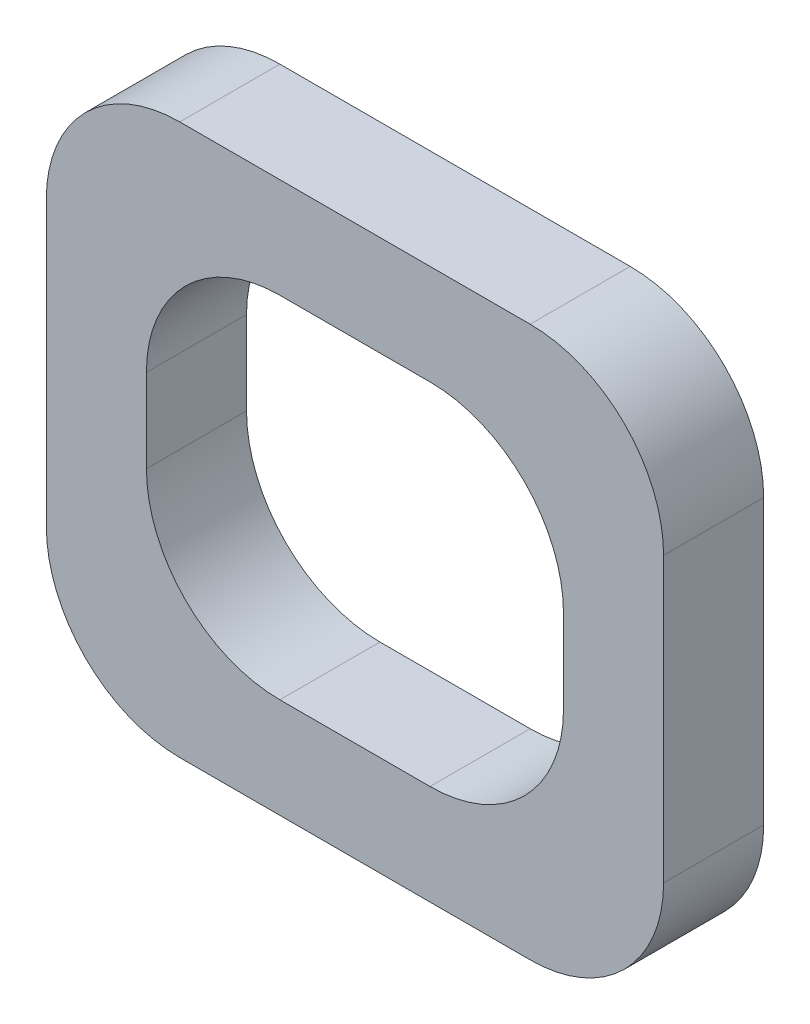
ISO-10303-21;
HEADER;
FILE_DESCRIPTION(('STEP AP214'),'2;1');
FILE_NAME('part.step','',(''),(''),'','','');
FILE_SCHEMA(('AUTOMOTIVE_DESIGN { 1 0 10303 214 1 1 1 1 }'));
ENDSEC;
DATA;
#1=APPLICATION_CONTEXT('core data for automotive mechanical design processes');
#2=APPLICATION_PROTOCOL_DEFINITION('international standard','automotive_design',2000,#1);
#3=PRODUCT_CONTEXT('',#1,'mechanical');
#4=PRODUCT('Part','Part','',(#3));
#5=PRODUCT_RELATED_PRODUCT_CATEGORY('part','',(#4));
#6=PRODUCT_DEFINITION_FORMATION('','',#4);
#7=PRODUCT_DEFINITION_CONTEXT('part definition',#1,'design');
#8=PRODUCT_DEFINITION('design','',#6,#7);
#9=PRODUCT_DEFINITION_SHAPE('','',#8);
#10=(LENGTH_UNIT() NAMED_UNIT(*) SI_UNIT(.MILLI.,.METRE.));
#11=(NAMED_UNIT(*) PLANE_ANGLE_UNIT() SI_UNIT($,.RADIAN.));
#12=(NAMED_UNIT(*) SI_UNIT($,.STERADIAN.) SOLID_ANGLE_UNIT());
#13=UNCERTAINTY_MEASURE_WITH_UNIT(LENGTH_MEASURE(1.E-05),#10,'distance_accuracy_value','');
#14=(GEOMETRIC_REPRESENTATION_CONTEXT(3) GLOBAL_UNCERTAINTY_ASSIGNED_CONTEXT((#13)) GLOBAL_UNIT_ASSIGNED_CONTEXT((#10,
#11,#12)) REPRESENTATION_CONTEXT('',''));
#15=CARTESIAN_POINT('',(0.,0.,0.));
#16=DIRECTION('',(0.,0.,1.));
#17=DIRECTION('',(1.,0.,0.));
#18=AXIS2_PLACEMENT_3D('',#15,#16,#17);
#19=CARTESIAN_POINT('',(0.,0.,3.));
#20=DIRECTION('',(0.,0.,1.));
#21=DIRECTION('',(1.,0.,0.));
#22=AXIS2_PLACEMENT_3D('',#19,#20,#21);
#23=PLANE('',#22);
#24=DIRECTION('',(-1.,0.,0.));
#25=VECTOR('',#24,1.);
#26=CARTESIAN_POINT('',(-9.25,8.25,3.));
#27=LINE('',#26,#25);
#28=CARTESIAN_POINT('',(5.25,8.25,3.));
#29=VERTEX_POINT('',#28);
#30=CARTESIAN_POINT('',(-5.25,8.25,3.));
#31=VERTEX_POINT('',#30);
#32=EDGE_CURVE('E284',#29,#31,#27,.T.);
#33=ORIENTED_EDGE('',*,*,#32,.T.);
#34=CARTESIAN_POINT('',(-5.25,4.25,3.));
#35=DIRECTION('',(0.,0.,1.));
#36=DIRECTION('',(1.,0.,0.));
#37=AXIS2_PLACEMENT_3D('',#34,#35,#36);
#38=CIRCLE('',#37,4.);
#39=CARTESIAN_POINT('',(-9.25,4.25,3.));
#40=VERTEX_POINT('',#39);
#41=EDGE_CURVE('E201',#31,#40,#38,.T.);
#42=ORIENTED_EDGE('',*,*,#41,.T.);
#43=DIRECTION('',(0.,-1.,0.));
#44=VECTOR('',#43,1.);
#45=CARTESIAN_POINT('',(-9.25,8.25,3.));
#46=LINE('',#45,#44);
#47=CARTESIAN_POINT('',(-9.25,-4.25,3.));
#48=VERTEX_POINT('',#47);
#49=EDGE_CURVE('E169',#40,#48,#46,.T.);
#50=ORIENTED_EDGE('',*,*,#49,.T.);
#51=CARTESIAN_POINT('',(-5.25,-4.25,3.));
#52=DIRECTION('',(0.,0.,1.));
#53=DIRECTION('',(1.,0.,0.));
#54=AXIS2_PLACEMENT_3D('',#51,#52,#53);
#55=CIRCLE('',#54,4.);
#56=CARTESIAN_POINT('',(-5.25,-8.25,3.));
#57=VERTEX_POINT('',#56);
#58=EDGE_CURVE('E197',#48,#57,#55,.T.);
#59=ORIENTED_EDGE('',*,*,#58,.T.);
#60=DIRECTION('',(1.,0.,0.));
#61=VECTOR('',#60,1.);
#62=CARTESIAN_POINT('',(-9.25,-8.25,3.));
#63=LINE('',#62,#61);
#64=CARTESIAN_POINT('',(5.25,-8.25,3.));
#65=VERTEX_POINT('',#64);
#66=EDGE_CURVE('E187',#57,#65,#63,.T.);
#67=ORIENTED_EDGE('',*,*,#66,.T.);
#68=CARTESIAN_POINT('',(5.25,-4.25,3.));
#69=DIRECTION('',(0.,0.,1.));
#70=DIRECTION('',(1.,0.,0.));
#71=AXIS2_PLACEMENT_3D('',#68,#69,#70);
#72=CIRCLE('',#71,4.);
#73=CARTESIAN_POINT('',(9.25,-4.25,3.));
#74=VERTEX_POINT('',#73);
#75=EDGE_CURVE('E199',#65,#74,#72,.T.);
#76=ORIENTED_EDGE('',*,*,#75,.T.);
#77=DIRECTION('',(0.,1.,0.));
#78=VECTOR('',#77,1.);
#79=CARTESIAN_POINT('',(9.25,8.25,3.));
#80=LINE('',#79,#78);
#81=CARTESIAN_POINT('',(9.25,4.25,3.));
#82=VERTEX_POINT('',#81);
#83=EDGE_CURVE('E181',#74,#82,#80,.T.);
#84=ORIENTED_EDGE('',*,*,#83,.T.);
#85=CARTESIAN_POINT('',(5.25,4.25,3.));
#86=DIRECTION('',(0.,0.,1.));
#87=DIRECTION('',(1.,0.,0.));
#88=AXIS2_PLACEMENT_3D('',#85,#86,#87);
#89=CIRCLE('',#88,4.);
#90=EDGE_CURVE('E195',#82,#29,#89,.T.);
#91=ORIENTED_EDGE('',*,*,#90,.T.);
#92=EDGE_LOOP('',(#33,#42,#50,#59,#67,#76,#84,#91));
#93=FACE_BOUND('',#92,.T.);
#94=DIRECTION('',(-1.,0.,0.));
#95=VECTOR('',#94,1.);
#96=CARTESIAN_POINT('',(-6.25,5.25,3.));
#97=LINE('',#96,#95);
#98=CARTESIAN_POINT('',(2.25,5.25,3.));
#99=VERTEX_POINT('',#98);
#100=CARTESIAN_POINT('',(-2.25,5.25,3.));
#101=VERTEX_POINT('',#100);
#102=EDGE_CURVE('E265',#99,#101,#97,.T.);
#103=ORIENTED_EDGE('',*,*,#102,.F.);
#104=CARTESIAN_POINT('',(2.25,1.25,3.));
#105=DIRECTION('',(0.,0.,1.));
#106=DIRECTION('',(1.,0.,0.));
#107=AXIS2_PLACEMENT_3D('',#104,#105,#106);
#108=CIRCLE('',#107,4.);
#109=CARTESIAN_POINT('',(6.25,1.25,3.));
#110=VERTEX_POINT('',#109);
#111=EDGE_CURVE('E11',#99,#110,#108,.F.);
#112=ORIENTED_EDGE('',*,*,#111,.T.);
#113=DIRECTION('',(0.,1.,0.));
#114=VECTOR('',#113,1.);
#115=CARTESIAN_POINT('',(6.25,5.25,3.));
#116=LINE('',#115,#114);
#117=CARTESIAN_POINT('',(6.25,-1.25,3.));
#118=VERTEX_POINT('',#117);
#119=EDGE_CURVE('E263',#118,#110,#116,.T.);
#120=ORIENTED_EDGE('',*,*,#119,.F.);
#121=CARTESIAN_POINT('',(2.25,-1.25,3.));
#122=DIRECTION('',(0.,0.,1.));
#123=DIRECTION('',(1.,0.,0.));
#124=AXIS2_PLACEMENT_3D('',#121,#122,#123);
#125=CIRCLE('',#124,4.);
#126=CARTESIAN_POINT('',(2.25,-5.25,3.));
#127=VERTEX_POINT('',#126);
#128=EDGE_CURVE('E241',#118,#127,#125,.F.);
#129=ORIENTED_EDGE('',*,*,#128,.T.);
#130=DIRECTION('',(1.,0.,0.));
#131=VECTOR('',#130,1.);
#132=CARTESIAN_POINT('',(-6.25,-5.25,3.));
#133=LINE('',#132,#131);
#134=CARTESIAN_POINT('',(-2.25,-5.25,3.));
#135=VERTEX_POINT('',#134);
#136=EDGE_CURVE('E276',#135,#127,#133,.T.);
#137=ORIENTED_EDGE('',*,*,#136,.F.);
#138=CARTESIAN_POINT('',(-2.25,-1.25,3.));
#139=DIRECTION('',(0.,0.,1.));
#140=DIRECTION('',(1.,0.,0.));
#141=AXIS2_PLACEMENT_3D('',#138,#139,#140);
#142=CIRCLE('',#141,4.);
#143=CARTESIAN_POINT('',(-6.25,-1.25,3.));
#144=VERTEX_POINT('',#143);
#145=EDGE_CURVE('E50',#135,#144,#142,.F.);
#146=ORIENTED_EDGE('',*,*,#145,.T.);
#147=DIRECTION('',(0.,-1.,0.));
#148=VECTOR('',#147,1.);
#149=CARTESIAN_POINT('',(-6.25,5.25,3.));
#150=LINE('',#149,#148);
#151=CARTESIAN_POINT('',(-6.25,1.25,3.));
#152=VERTEX_POINT('',#151);
#153=EDGE_CURVE('E271',#152,#144,#150,.T.);
#154=ORIENTED_EDGE('',*,*,#153,.F.);
#155=CARTESIAN_POINT('',(-2.25,1.25,3.));
#156=DIRECTION('',(0.,0.,1.));
#157=DIRECTION('',(1.,0.,0.));
#158=AXIS2_PLACEMENT_3D('',#155,#156,#157);
#159=CIRCLE('',#158,4.);
#160=EDGE_CURVE('E237',#152,#101,#159,.F.);
#161=ORIENTED_EDGE('',*,*,#160,.T.);
#162=EDGE_LOOP('',(#103,#112,#120,#129,#137,#146,#154,#161));
#163=FACE_BOUND('',#162,.T.);
#164=ADVANCED_FACE('F35',(#93,#163),#23,.T.);
#165=CARTESIAN_POINT('',(0.,0.,0.));
#166=DIRECTION('',(0.,0.,1.));
#167=DIRECTION('',(1.,0.,0.));
#168=AXIS2_PLACEMENT_3D('',#165,#166,#167);
#169=PLANE('',#168);
#170=DIRECTION('',(0.,-1.,0.));
#171=VECTOR('',#170,1.);
#172=CARTESIAN_POINT('',(-9.25,8.25,0.));
#173=LINE('',#172,#171);
#174=CARTESIAN_POINT('',(-9.25,4.25,0.));
#175=VERTEX_POINT('',#174);
#176=CARTESIAN_POINT('',(-9.25,-4.25,0.));
#177=VERTEX_POINT('',#176);
#178=EDGE_CURVE('E166',#175,#177,#173,.T.);
#179=ORIENTED_EDGE('',*,*,#178,.F.);
#180=CARTESIAN_POINT('',(-5.25,4.25,0.));
#181=DIRECTION('',(0.,0.,1.));
#182=DIRECTION('',(1.,0.,0.));
#183=AXIS2_PLACEMENT_3D('',#180,#181,#182);
#184=CIRCLE('',#183,4.);
#185=CARTESIAN_POINT('',(-5.25,8.25,0.));
#186=VERTEX_POINT('',#185);
#187=EDGE_CURVE('E149',#175,#186,#184,.F.);
#188=ORIENTED_EDGE('',*,*,#187,.T.);
#189=DIRECTION('',(-1.,0.,0.));
#190=VECTOR('',#189,1.);
#191=CARTESIAN_POINT('',(-9.25,8.25,0.));
#192=LINE('',#191,#190);
#193=CARTESIAN_POINT('',(5.25,8.25,0.));
#194=VERTEX_POINT('',#193);
#195=EDGE_CURVE('E178',#194,#186,#192,.T.);
#196=ORIENTED_EDGE('',*,*,#195,.F.);
#197=CARTESIAN_POINT('',(5.25,4.25,0.));
#198=DIRECTION('',(0.,0.,1.));
#199=DIRECTION('',(1.,0.,0.));
#200=AXIS2_PLACEMENT_3D('',#197,#198,#199);
#201=CIRCLE('',#200,4.);
#202=CARTESIAN_POINT('',(9.25,4.25,0.));
#203=VERTEX_POINT('',#202);
#204=EDGE_CURVE('E170',#194,#203,#201,.F.);
#205=ORIENTED_EDGE('',*,*,#204,.T.);
#206=DIRECTION('',(0.,1.,0.));
#207=VECTOR('',#206,1.);
#208=CARTESIAN_POINT('',(9.25,8.25,0.));
#209=LINE('',#208,#207);
#210=CARTESIAN_POINT('',(9.25,-4.25,0.));
#211=VERTEX_POINT('',#210);
#212=EDGE_CURVE('E183',#211,#203,#209,.T.);
#213=ORIENTED_EDGE('',*,*,#212,.F.);
#214=CARTESIAN_POINT('',(5.25,-4.25,0.));
#215=DIRECTION('',(0.,0.,1.));
#216=DIRECTION('',(1.,0.,0.));
#217=AXIS2_PLACEMENT_3D('',#214,#215,#216);
#218=CIRCLE('',#217,4.);
#219=CARTESIAN_POINT('',(5.25,-8.25,0.));
#220=VERTEX_POINT('',#219);
#221=EDGE_CURVE('E160',#211,#220,#218,.F.);
#222=ORIENTED_EDGE('',*,*,#221,.T.);
#223=DIRECTION('',(1.,0.,0.));
#224=VECTOR('',#223,1.);
#225=CARTESIAN_POINT('',(-9.25,-8.25,0.));
#226=LINE('',#225,#224);
#227=CARTESIAN_POINT('',(-5.25,-8.25,0.));
#228=VERTEX_POINT('',#227);
#229=EDGE_CURVE('E177',#228,#220,#226,.T.);
#230=ORIENTED_EDGE('',*,*,#229,.F.);
#231=CARTESIAN_POINT('',(-5.25,-4.25,0.));
#232=DIRECTION('',(0.,0.,1.));
#233=DIRECTION('',(1.,0.,0.));
#234=AXIS2_PLACEMENT_3D('',#231,#232,#233);
#235=CIRCLE('',#234,4.);
#236=EDGE_CURVE('E176',#228,#177,#235,.F.);
#237=ORIENTED_EDGE('',*,*,#236,.T.);
#238=EDGE_LOOP('',(#179,#188,#196,#205,#213,#222,#230,#237));
#239=FACE_BOUND('',#238,.T.);
#240=DIRECTION('',(1.,0.,0.));
#241=VECTOR('',#240,1.);
#242=CARTESIAN_POINT('',(-6.25,-5.25,0.));
#243=LINE('',#242,#241);
#244=CARTESIAN_POINT('',(-2.25,-5.25,0.));
#245=VERTEX_POINT('',#244);
#246=CARTESIAN_POINT('',(2.25,-5.25,0.));
#247=VERTEX_POINT('',#246);
#248=EDGE_CURVE('E269',#245,#247,#243,.T.);
#249=ORIENTED_EDGE('',*,*,#248,.T.);
#250=CARTESIAN_POINT('',(2.25,-1.25,0.));
#251=DIRECTION('',(0.,0.,1.));
#252=DIRECTION('',(1.,0.,0.));
#253=AXIS2_PLACEMENT_3D('',#250,#251,#252);
#254=CIRCLE('',#253,4.);
#255=CARTESIAN_POINT('',(6.25,-1.25,0.));
#256=VERTEX_POINT('',#255);
#257=EDGE_CURVE('E239',#247,#256,#254,.T.);
#258=ORIENTED_EDGE('',*,*,#257,.T.);
#259=DIRECTION('',(0.,1.,0.));
#260=VECTOR('',#259,1.);
#261=CARTESIAN_POINT('',(6.25,5.25,0.));
#262=LINE('',#261,#260);
#263=CARTESIAN_POINT('',(6.25,1.25,0.));
#264=VERTEX_POINT('',#263);
#265=EDGE_CURVE('E248',#256,#264,#262,.T.);
#266=ORIENTED_EDGE('',*,*,#265,.T.);
#267=CARTESIAN_POINT('',(2.25,1.25,0.));
#268=DIRECTION('',(0.,0.,1.));
#269=DIRECTION('',(1.,0.,0.));
#270=AXIS2_PLACEMENT_3D('',#267,#268,#269);
#271=CIRCLE('',#270,4.);
#272=CARTESIAN_POINT('',(2.25,5.25,0.));
#273=VERTEX_POINT('',#272);
#274=EDGE_CURVE('E43',#264,#273,#271,.T.);
#275=ORIENTED_EDGE('',*,*,#274,.T.);
#276=DIRECTION('',(-1.,0.,0.));
#277=VECTOR('',#276,1.);
#278=CARTESIAN_POINT('',(-6.25,5.25,0.));
#279=LINE('',#278,#277);
#280=CARTESIAN_POINT('',(-2.25,5.25,0.));
#281=VERTEX_POINT('',#280);
#282=EDGE_CURVE('E246',#273,#281,#279,.T.);
#283=ORIENTED_EDGE('',*,*,#282,.T.);
#284=CARTESIAN_POINT('',(-2.25,1.25,0.));
#285=DIRECTION('',(0.,0.,1.));
#286=DIRECTION('',(1.,0.,0.));
#287=AXIS2_PLACEMENT_3D('',#284,#285,#286);
#288=CIRCLE('',#287,4.);
#289=CARTESIAN_POINT('',(-6.25,1.25,0.));
#290=VERTEX_POINT('',#289);
#291=EDGE_CURVE('E235',#281,#290,#288,.T.);
#292=ORIENTED_EDGE('',*,*,#291,.T.);
#293=DIRECTION('',(0.,-1.,0.));
#294=VECTOR('',#293,1.);
#295=CARTESIAN_POINT('',(-6.25,5.25,0.));
#296=LINE('',#295,#294);
#297=CARTESIAN_POINT('',(-6.25,-1.25,0.));
#298=VERTEX_POINT('',#297);
#299=EDGE_CURVE('E257',#290,#298,#296,.T.);
#300=ORIENTED_EDGE('',*,*,#299,.T.);
#301=CARTESIAN_POINT('',(-2.25,-1.25,0.));
#302=DIRECTION('',(0.,0.,1.));
#303=DIRECTION('',(1.,0.,0.));
#304=AXIS2_PLACEMENT_3D('',#301,#302,#303);
#305=CIRCLE('',#304,4.);
#306=EDGE_CURVE('E232',#298,#245,#305,.T.);
#307=ORIENTED_EDGE('',*,*,#306,.T.);
#308=EDGE_LOOP('',(#249,#258,#266,#275,#283,#292,#300,#307));
#309=FACE_BOUND('',#308,.T.);
#310=ADVANCED_FACE('F173',(#239,#309),#169,.F.);
#311=CARTESIAN_POINT('',(9.25,8.25,3.));
#312=DIRECTION('',(-1.,0.,0.));
#313=DIRECTION('',(0.,-1.,0.));
#314=AXIS2_PLACEMENT_3D('',#311,#312,#313);
#315=PLANE('',#314);
#316=ORIENTED_EDGE('',*,*,#83,.F.);
#317=DIRECTION('',(0.,0.,-1.));
#318=VECTOR('',#317,1.);
#319=CARTESIAN_POINT('',(9.25,-4.25,3.));
#320=LINE('',#319,#318);
#321=EDGE_CURVE('E224',#74,#211,#320,.T.);
#322=ORIENTED_EDGE('',*,*,#321,.T.);
#323=ORIENTED_EDGE('',*,*,#212,.T.);
#324=DIRECTION('',(0.,0.,-1.));
#325=VECTOR('',#324,1.);
#326=CARTESIAN_POINT('',(9.25,4.25,3.));
#327=LINE('',#326,#325);
#328=EDGE_CURVE('E222',#203,#82,#327,.F.);
#329=ORIENTED_EDGE('',*,*,#328,.T.);
#330=EDGE_LOOP('',(#316,#322,#323,#329));
#331=FACE_BOUND('',#330,.T.);
#332=ADVANCED_FACE('F294',(#331),#315,.F.);
#333=CARTESIAN_POINT('',(-9.25,8.25,3.));
#334=DIRECTION('',(0.,-1.,0.));
#335=DIRECTION('',(1.,0.,0.));
#336=AXIS2_PLACEMENT_3D('',#333,#334,#335);
#337=PLANE('',#336);
#338=ORIENTED_EDGE('',*,*,#195,.T.);
#339=DIRECTION('',(0.,0.,-1.));
#340=VECTOR('',#339,1.);
#341=CARTESIAN_POINT('',(-5.25,8.25,3.));
#342=LINE('',#341,#340);
#343=EDGE_CURVE('E154',#186,#31,#342,.F.);
#344=ORIENTED_EDGE('',*,*,#343,.T.);
#345=ORIENTED_EDGE('',*,*,#32,.F.);
#346=DIRECTION('',(0.,0.,-1.));
#347=VECTOR('',#346,1.);
#348=CARTESIAN_POINT('',(5.25,8.25,3.));
#349=LINE('',#348,#347);
#350=EDGE_CURVE('E159',#29,#194,#349,.T.);
#351=ORIENTED_EDGE('',*,*,#350,.T.);
#352=EDGE_LOOP('',(#338,#344,#345,#351));
#353=FACE_BOUND('',#352,.T.);
#354=ADVANCED_FACE('F302',(#353),#337,.F.);
#355=CARTESIAN_POINT('',(-9.25,8.25,3.));
#356=DIRECTION('',(1.,0.,0.));
#357=DIRECTION('',(0.,1.,0.));
#358=AXIS2_PLACEMENT_3D('',#355,#356,#357);
#359=PLANE('',#358);
#360=ORIENTED_EDGE('',*,*,#49,.F.);
#361=DIRECTION('',(0.,0.,-1.));
#362=VECTOR('',#361,1.);
#363=CARTESIAN_POINT('',(-9.25,4.25,3.));
#364=LINE('',#363,#362);
#365=EDGE_CURVE('E153',#40,#175,#364,.T.);
#366=ORIENTED_EDGE('',*,*,#365,.T.);
#367=ORIENTED_EDGE('',*,*,#178,.T.);
#368=DIRECTION('',(0.,0.,-1.));
#369=VECTOR('',#368,1.);
#370=CARTESIAN_POINT('',(-9.25,-4.25,3.));
#371=LINE('',#370,#369);
#372=EDGE_CURVE('E171',#177,#48,#371,.F.);
#373=ORIENTED_EDGE('',*,*,#372,.T.);
#374=EDGE_LOOP('',(#360,#366,#367,#373));
#375=FACE_BOUND('',#374,.T.);
#376=ADVANCED_FACE('F165',(#375),#359,.F.);
#377=CARTESIAN_POINT('',(-9.25,-8.25,3.));
#378=DIRECTION('',(0.,1.,0.));
#379=DIRECTION('',(0.,0.,1.));
#380=AXIS2_PLACEMENT_3D('',#377,#378,#379);
#381=PLANE('',#380);
#382=ORIENTED_EDGE('',*,*,#229,.T.);
#383=DIRECTION('',(0.,0.,-1.));
#384=VECTOR('',#383,1.);
#385=CARTESIAN_POINT('',(5.25,-8.25,3.));
#386=LINE('',#385,#384);
#387=EDGE_CURVE('E230',#220,#65,#386,.F.);
#388=ORIENTED_EDGE('',*,*,#387,.T.);
#389=ORIENTED_EDGE('',*,*,#66,.F.);
#390=DIRECTION('',(0.,0.,-1.));
#391=VECTOR('',#390,1.);
#392=CARTESIAN_POINT('',(-5.25,-8.25,3.));
#393=LINE('',#392,#391);
#394=EDGE_CURVE('E227',#57,#228,#393,.T.);
#395=ORIENTED_EDGE('',*,*,#394,.T.);
#396=EDGE_LOOP('',(#382,#388,#389,#395));
#397=FACE_BOUND('',#396,.T.);
#398=ADVANCED_FACE('F309',(#397),#381,.F.);
#399=CARTESIAN_POINT('',(6.25,5.25,3.));
#400=DIRECTION('',(-1.,0.,0.));
#401=DIRECTION('',(0.,0.,1.));
#402=AXIS2_PLACEMENT_3D('',#399,#400,#401);
#403=PLANE('',#402);
#404=ORIENTED_EDGE('',*,*,#265,.F.);
#405=DIRECTION('',(0.,0.,-1.));
#406=VECTOR('',#405,1.);
#407=CARTESIAN_POINT('',(6.25,-1.25,3.));
#408=LINE('',#407,#406);
#409=EDGE_CURVE('E220',#256,#118,#408,.F.);
#410=ORIENTED_EDGE('',*,*,#409,.T.);
#411=ORIENTED_EDGE('',*,*,#119,.T.);
#412=DIRECTION('',(0.,0.,-1.));
#413=VECTOR('',#412,1.);
#414=CARTESIAN_POINT('',(6.25,1.25,0.));
#415=LINE('',#414,#413);
#416=EDGE_CURVE('E217',#110,#264,#415,.T.);
#417=ORIENTED_EDGE('',*,*,#416,.T.);
#418=EDGE_LOOP('',(#404,#410,#411,#417));
#419=FACE_BOUND('',#418,.T.);
#420=ADVANCED_FACE('F267',(#419),#403,.T.);
#421=CARTESIAN_POINT('',(-6.25,5.25,3.));
#422=DIRECTION('',(0.,-1.,0.));
#423=DIRECTION('',(1.,0.,0.));
#424=AXIS2_PLACEMENT_3D('',#421,#422,#423);
#425=PLANE('',#424);
#426=ORIENTED_EDGE('',*,*,#102,.T.);
#427=DIRECTION('',(0.,0.,-1.));
#428=VECTOR('',#427,1.);
#429=CARTESIAN_POINT('',(-2.25,5.25,0.));
#430=LINE('',#429,#428);
#431=EDGE_CURVE('E214',#101,#281,#430,.T.);
#432=ORIENTED_EDGE('',*,*,#431,.T.);
#433=ORIENTED_EDGE('',*,*,#282,.F.);
#434=DIRECTION('',(0.,0.,-1.));
#435=VECTOR('',#434,1.);
#436=CARTESIAN_POINT('',(2.25,5.25,3.));
#437=LINE('',#436,#435);
#438=EDGE_CURVE('E212',#273,#99,#437,.F.);
#439=ORIENTED_EDGE('',*,*,#438,.T.);
#440=EDGE_LOOP('',(#426,#432,#433,#439));
#441=FACE_BOUND('',#440,.T.);
#442=ADVANCED_FACE('F254',(#441),#425,.T.);
#443=CARTESIAN_POINT('',(-6.25,5.25,3.));
#444=DIRECTION('',(1.,0.,0.));
#445=DIRECTION('',(0.,1.,0.));
#446=AXIS2_PLACEMENT_3D('',#443,#444,#445);
#447=PLANE('',#446);
#448=ORIENTED_EDGE('',*,*,#153,.T.);
#449=DIRECTION('',(0.,0.,-1.));
#450=VECTOR('',#449,1.);
#451=CARTESIAN_POINT('',(-6.25,-1.25,0.));
#452=LINE('',#451,#450);
#453=EDGE_CURVE('E204',#144,#298,#452,.T.);
#454=ORIENTED_EDGE('',*,*,#453,.T.);
#455=ORIENTED_EDGE('',*,*,#299,.F.);
#456=DIRECTION('',(0.,0.,-1.));
#457=VECTOR('',#456,1.);
#458=CARTESIAN_POINT('',(-6.25,1.25,3.));
#459=LINE('',#458,#457);
#460=EDGE_CURVE('E57',#290,#152,#459,.F.);
#461=ORIENTED_EDGE('',*,*,#460,.T.);
#462=EDGE_LOOP('',(#448,#454,#455,#461));
#463=FACE_BOUND('',#462,.T.);
#464=ADVANCED_FACE('F360',(#463),#447,.T.);
#465=CARTESIAN_POINT('',(-6.25,-5.25,3.));
#466=DIRECTION('',(0.,1.,0.));
#467=DIRECTION('',(-1.,0.,0.));
#468=AXIS2_PLACEMENT_3D('',#465,#466,#467);
#469=PLANE('',#468);
#470=ORIENTED_EDGE('',*,*,#248,.F.);
#471=DIRECTION('',(0.,0.,-1.));
#472=VECTOR('',#471,1.);
#473=CARTESIAN_POINT('',(-2.25,-5.25,3.));
#474=LINE('',#473,#472);
#475=EDGE_CURVE('E210',#245,#135,#474,.F.);
#476=ORIENTED_EDGE('',*,*,#475,.T.);
#477=ORIENTED_EDGE('',*,*,#136,.T.);
#478=DIRECTION('',(0.,0.,-1.));
#479=VECTOR('',#478,1.);
#480=CARTESIAN_POINT('',(2.25,-5.25,0.));
#481=LINE('',#480,#479);
#482=EDGE_CURVE('E207',#127,#247,#481,.T.);
#483=ORIENTED_EDGE('',*,*,#482,.T.);
#484=EDGE_LOOP('',(#470,#476,#477,#483));
#485=FACE_BOUND('',#484,.T.);
#486=ADVANCED_FACE('F356',(#485),#469,.T.);
#487=CARTESIAN_POINT('',(-5.25,4.25,3.));
#488=DIRECTION('',(0.,0.,-1.));
#489=DIRECTION('',(-1.,0.,0.));
#490=AXIS2_PLACEMENT_3D('',#487,#488,#489);
#491=CYLINDRICAL_SURFACE('',#490,4.);
#492=ORIENTED_EDGE('',*,*,#41,.F.);
#493=ORIENTED_EDGE('',*,*,#343,.F.);
#494=ORIENTED_EDGE('',*,*,#187,.F.);
#495=ORIENTED_EDGE('',*,*,#365,.F.);
#496=EDGE_LOOP('',(#492,#493,#494,#495));
#497=FACE_BOUND('',#496,.T.);
#498=ADVANCED_FACE('F152',(#497),#491,.T.);
#499=CARTESIAN_POINT('',(-2.25,-1.25,3.));
#500=DIRECTION('',(0.,0.,1.));
#501=DIRECTION('',(1.,0.,0.));
#502=AXIS2_PLACEMENT_3D('',#499,#500,#501);
#503=CYLINDRICAL_SURFACE('',#502,4.);
#504=ORIENTED_EDGE('',*,*,#145,.F.);
#505=ORIENTED_EDGE('',*,*,#475,.F.);
#506=ORIENTED_EDGE('',*,*,#306,.F.);
#507=ORIENTED_EDGE('',*,*,#453,.F.);
#508=EDGE_LOOP('',(#504,#505,#506,#507));
#509=FACE_BOUND('',#508,.T.);
#510=ADVANCED_FACE('F350',(#509),#503,.F.);
#511=CARTESIAN_POINT('',(-2.25,1.25,3.));
#512=DIRECTION('',(0.,0.,1.));
#513=DIRECTION('',(1.,0.,0.));
#514=AXIS2_PLACEMENT_3D('',#511,#512,#513);
#515=CYLINDRICAL_SURFACE('',#514,4.);
#516=ORIENTED_EDGE('',*,*,#160,.F.);
#517=ORIENTED_EDGE('',*,*,#460,.F.);
#518=ORIENTED_EDGE('',*,*,#291,.F.);
#519=ORIENTED_EDGE('',*,*,#431,.F.);
#520=EDGE_LOOP('',(#516,#517,#518,#519));
#521=FACE_BOUND('',#520,.T.);
#522=ADVANCED_FACE('F346',(#521),#515,.F.);
#523=CARTESIAN_POINT('',(2.25,-1.25,3.));
#524=DIRECTION('',(0.,0.,1.));
#525=DIRECTION('',(1.,0.,0.));
#526=AXIS2_PLACEMENT_3D('',#523,#524,#525);
#527=CYLINDRICAL_SURFACE('',#526,4.);
#528=ORIENTED_EDGE('',*,*,#128,.F.);
#529=ORIENTED_EDGE('',*,*,#409,.F.);
#530=ORIENTED_EDGE('',*,*,#257,.F.);
#531=ORIENTED_EDGE('',*,*,#482,.F.);
#532=EDGE_LOOP('',(#528,#529,#530,#531));
#533=FACE_BOUND('',#532,.T.);
#534=ADVANCED_FACE('F341',(#533),#527,.F.);
#535=CARTESIAN_POINT('',(5.25,-4.25,3.));
#536=DIRECTION('',(0.,0.,-1.));
#537=DIRECTION('',(-1.,0.,0.));
#538=AXIS2_PLACEMENT_3D('',#535,#536,#537);
#539=CYLINDRICAL_SURFACE('',#538,4.);
#540=ORIENTED_EDGE('',*,*,#75,.F.);
#541=ORIENTED_EDGE('',*,*,#387,.F.);
#542=ORIENTED_EDGE('',*,*,#221,.F.);
#543=ORIENTED_EDGE('',*,*,#321,.F.);
#544=EDGE_LOOP('',(#540,#541,#542,#543));
#545=FACE_BOUND('',#544,.T.);
#546=ADVANCED_FACE('F331',(#545),#539,.T.);
#547=CARTESIAN_POINT('',(-5.25,-4.25,3.));
#548=DIRECTION('',(0.,0.,-1.));
#549=DIRECTION('',(-1.,0.,0.));
#550=AXIS2_PLACEMENT_3D('',#547,#548,#549);
#551=CYLINDRICAL_SURFACE('',#550,4.);
#552=ORIENTED_EDGE('',*,*,#58,.F.);
#553=ORIENTED_EDGE('',*,*,#372,.F.);
#554=ORIENTED_EDGE('',*,*,#236,.F.);
#555=ORIENTED_EDGE('',*,*,#394,.F.);
#556=EDGE_LOOP('',(#552,#553,#554,#555));
#557=FACE_BOUND('',#556,.T.);
#558=ADVANCED_FACE('F334',(#557),#551,.T.);
#559=CARTESIAN_POINT('',(2.25,1.25,3.));
#560=DIRECTION('',(0.,0.,1.));
#561=DIRECTION('',(1.,0.,0.));
#562=AXIS2_PLACEMENT_3D('',#559,#560,#561);
#563=CYLINDRICAL_SURFACE('',#562,4.);
#564=ORIENTED_EDGE('',*,*,#111,.F.);
#565=ORIENTED_EDGE('',*,*,#438,.F.);
#566=ORIENTED_EDGE('',*,*,#274,.F.);
#567=ORIENTED_EDGE('',*,*,#416,.F.);
#568=EDGE_LOOP('',(#564,#565,#566,#567));
#569=FACE_BOUND('',#568,.T.);
#570=ADVANCED_FACE('F260',(#569),#563,.F.);
#571=CARTESIAN_POINT('',(5.25,4.25,3.));
#572=DIRECTION('',(0.,0.,-1.));
#573=DIRECTION('',(-1.,0.,0.));
#574=AXIS2_PLACEMENT_3D('',#571,#572,#573);
#575=CYLINDRICAL_SURFACE('',#574,4.);
#576=ORIENTED_EDGE('',*,*,#90,.F.);
#577=ORIENTED_EDGE('',*,*,#328,.F.);
#578=ORIENTED_EDGE('',*,*,#204,.F.);
#579=ORIENTED_EDGE('',*,*,#350,.F.);
#580=EDGE_LOOP('',(#576,#577,#578,#579));
#581=FACE_BOUND('',#580,.T.);
#582=ADVANCED_FACE('F37',(#581),#575,.T.);
#583=CLOSED_SHELL('',(#164,#310,#332,#354,#376,#398,#420,#442,#464,#486,#498,#510,#522,#534,
#546,#558,#570,#582));
#584=MANIFOLD_SOLID_BREP('B2',#583);
#585=ADVANCED_BREP_SHAPE_REPRESENTATION('',(#18,#584),#14);
#586=SHAPE_DEFINITION_REPRESENTATION(#9,#585);
ENDSEC;
END-ISO-10303-21;
